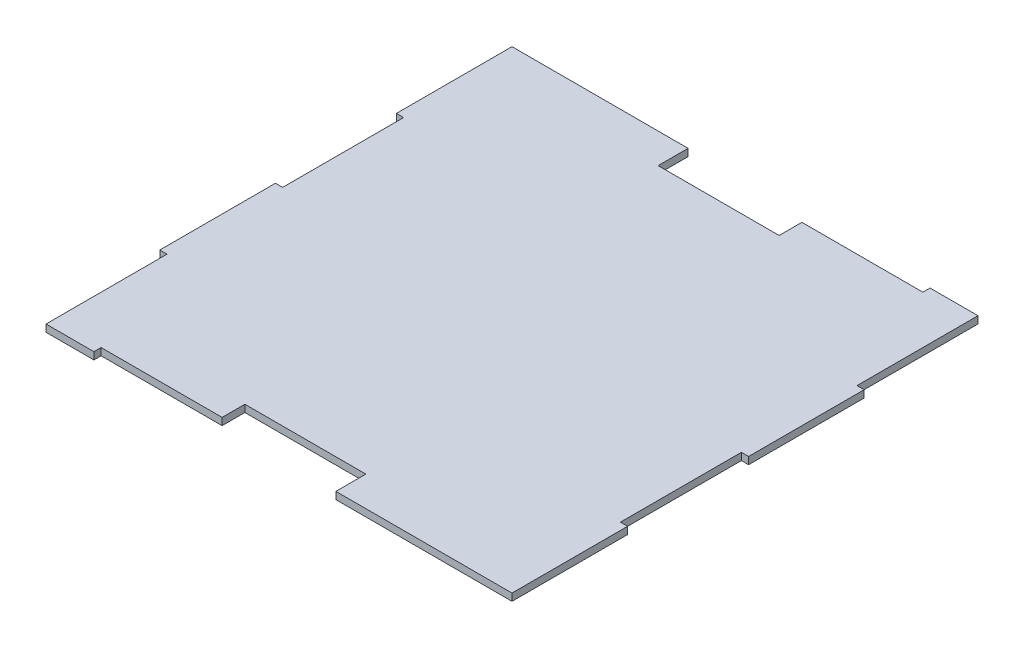
ISO-10303-21;
HEADER;
FILE_DESCRIPTION(('STEP AP214'),'2;1');
FILE_NAME('part.step','',(''),(''),'','','');
FILE_SCHEMA(('AUTOMOTIVE_DESIGN { 1 0 10303 214 1 1 1 1 }'));
ENDSEC;
DATA;
#1=APPLICATION_CONTEXT('core data for automotive mechanical design processes');
#2=APPLICATION_PROTOCOL_DEFINITION('international standard','automotive_design',2000,#1);
#3=PRODUCT_CONTEXT('',#1,'mechanical');
#4=PRODUCT('Part','Part','',(#3));
#5=PRODUCT_RELATED_PRODUCT_CATEGORY('part','',(#4));
#6=PRODUCT_DEFINITION_FORMATION('','',#4);
#7=PRODUCT_DEFINITION_CONTEXT('part definition',#1,'design');
#8=PRODUCT_DEFINITION('design','',#6,#7);
#9=PRODUCT_DEFINITION_SHAPE('','',#8);
#10=(LENGTH_UNIT() NAMED_UNIT(*) SI_UNIT(.MILLI.,.METRE.));
#11=(NAMED_UNIT(*) PLANE_ANGLE_UNIT() SI_UNIT($,.RADIAN.));
#12=(NAMED_UNIT(*) SI_UNIT($,.STERADIAN.) SOLID_ANGLE_UNIT());
#13=UNCERTAINTY_MEASURE_WITH_UNIT(LENGTH_MEASURE(1.E-05),#10,'distance_accuracy_value','');
#14=(GEOMETRIC_REPRESENTATION_CONTEXT(3) GLOBAL_UNCERTAINTY_ASSIGNED_CONTEXT((#13)) GLOBAL_UNIT_ASSIGNED_CONTEXT((#10,
#11,#12)) REPRESENTATION_CONTEXT('',''));
#15=CARTESIAN_POINT('',(0.,0.,0.));
#16=DIRECTION('',(0.,0.,1.));
#17=DIRECTION('',(1.,0.,0.));
#18=AXIS2_PLACEMENT_3D('',#15,#16,#17);
#19=CARTESIAN_POINT('',(191.5,6.,-1.052513411959E-13));
#20=DIRECTION('',(1.,0.,0.));
#21=DIRECTION('',(0.,0.,-1.));
#22=AXIS2_PLACEMENT_3D('',#19,#20,#21);
#23=PLANE('',#22);
#24=DIRECTION('',(0.,0.,1.));
#25=VECTOR('',#24,1.);
#26=CARTESIAN_POINT('',(191.5,0.,-1.052513411959E-13));
#27=LINE('',#26,#25);
#28=CARTESIAN_POINT('',(191.5,0.,2.27368041398871E-12));
#29=VERTEX_POINT('',#28);
#30=CARTESIAN_POINT('',(191.5,0.,101.));
#31=VERTEX_POINT('',#30);
#32=EDGE_CURVE('E337',#29,#31,#27,.T.);
#33=ORIENTED_EDGE('',*,*,#32,.F.);
#34=DIRECTION('',(0.,-1.,0.));
#35=VECTOR('',#34,1.);
#36=CARTESIAN_POINT('',(191.5,6.,2.27368041398871E-12));
#37=LINE('',#36,#35);
#38=CARTESIAN_POINT('',(191.5,6.,2.27368041398871E-12));
#39=VERTEX_POINT('',#38);
#40=EDGE_CURVE('E11',#39,#29,#37,.T.);
#41=ORIENTED_EDGE('',*,*,#40,.F.);
#42=DIRECTION('',(0.,0.,1.));
#43=VECTOR('',#42,1.);
#44=CARTESIAN_POINT('',(191.5,6.,-1.052513411959E-13));
#45=LINE('',#44,#43);
#46=CARTESIAN_POINT('',(191.5,6.,101.));
#47=VERTEX_POINT('',#46);
#48=EDGE_CURVE('E261',#39,#47,#45,.T.);
#49=ORIENTED_EDGE('',*,*,#48,.T.);
#50=DIRECTION('',(0.,-1.,0.));
#51=VECTOR('',#50,1.);
#52=CARTESIAN_POINT('',(191.5,6.,101.));
#53=LINE('',#52,#51);
#54=EDGE_CURVE('E152',#47,#31,#53,.T.);
#55=ORIENTED_EDGE('',*,*,#54,.T.);
#56=EDGE_LOOP('',(#33,#41,#49,#55));
#57=FACE_BOUND('',#56,.T.);
#58=ADVANCED_FACE('F41',(#57),#23,.T.);
#59=CARTESIAN_POINT('',(0.,6.,0.));
#60=DIRECTION('',(0.,0.,1.));
#61=DIRECTION('',(1.,0.,0.));
#62=AXIS2_PLACEMENT_3D('',#59,#60,#61);
#63=PLANE('',#62);
#64=DIRECTION('',(-1.,0.,0.));
#65=VECTOR('',#64,1.);
#66=CARTESIAN_POINT('',(0.,0.,0.));
#67=LINE('',#66,#65);
#68=CARTESIAN_POINT('',(197.5,0.,2.30929942830708E-12));
#69=VERTEX_POINT('',#68);
#70=EDGE_CURVE('E332',#69,#29,#67,.T.);
#71=ORIENTED_EDGE('',*,*,#70,.F.);
#72=DIRECTION('',(0.,-1.,0.));
#73=VECTOR('',#72,1.);
#74=CARTESIAN_POINT('',(197.5,6.,2.30929942830708E-12));
#75=LINE('',#74,#73);
#76=CARTESIAN_POINT('',(197.5,6.,2.30929942830708E-12));
#77=VERTEX_POINT('',#76);
#78=EDGE_CURVE('E49',#77,#69,#75,.T.);
#79=ORIENTED_EDGE('',*,*,#78,.F.);
#80=DIRECTION('',(-1.,0.,0.));
#81=VECTOR('',#80,1.);
#82=CARTESIAN_POINT('',(0.,6.,0.));
#83=LINE('',#82,#81);
#84=EDGE_CURVE('E255',#77,#39,#83,.T.);
#85=ORIENTED_EDGE('',*,*,#84,.T.);
#86=ORIENTED_EDGE('',*,*,#40,.T.);
#87=EDGE_LOOP('',(#71,#79,#85,#86));
#88=FACE_BOUND('',#87,.T.);
#89=ADVANCED_FACE('F336',(#88),#63,.T.);
#90=CARTESIAN_POINT('',(197.5,6.,0.));
#91=DIRECTION('',(-1.,0.,0.));
#92=DIRECTION('',(0.,0.,1.));
#93=AXIS2_PLACEMENT_3D('',#90,#91,#92);
#94=PLANE('',#93);
#95=DIRECTION('',(0.,0.,-1.));
#96=VECTOR('',#95,1.);
#97=CARTESIAN_POINT('',(197.5,0.,0.));
#98=LINE('',#97,#96);
#99=CARTESIAN_POINT('',(197.5,0.,-96.4999999999999));
#100=VERTEX_POINT('',#99);
#101=EDGE_CURVE('E270',#69,#100,#98,.T.);
#102=ORIENTED_EDGE('',*,*,#101,.T.);
#103=DIRECTION('',(0.,-1.,0.));
#104=VECTOR('',#103,1.);
#105=CARTESIAN_POINT('',(197.5,6.,-96.4999999999999));
#106=LINE('',#105,#104);
#107=CARTESIAN_POINT('',(197.5,6.,-96.4999999999999));
#108=VERTEX_POINT('',#107);
#109=EDGE_CURVE('E322',#108,#100,#106,.T.);
#110=ORIENTED_EDGE('',*,*,#109,.F.);
#111=DIRECTION('',(0.,0.,-1.));
#112=VECTOR('',#111,1.);
#113=CARTESIAN_POINT('',(197.5,6.,0.));
#114=LINE('',#113,#112);
#115=EDGE_CURVE('E250',#77,#108,#114,.T.);
#116=ORIENTED_EDGE('',*,*,#115,.F.);
#117=ORIENTED_EDGE('',*,*,#78,.T.);
#118=EDGE_LOOP('',(#102,#110,#116,#117));
#119=FACE_BOUND('',#118,.T.);
#120=ADVANCED_FACE('F326',(#119),#94,.F.);
#121=CARTESIAN_POINT('',(0.,6.,-96.4999999999999));
#122=DIRECTION('',(0.,0.,1.));
#123=DIRECTION('',(1.,0.,0.));
#124=AXIS2_PLACEMENT_3D('',#121,#122,#123);
#125=PLANE('',#124);
#126=DIRECTION('',(-1.,0.,0.));
#127=VECTOR('',#126,1.);
#128=CARTESIAN_POINT('',(0.,0.,-96.4999999999999));
#129=LINE('',#128,#127);
#130=CARTESIAN_POINT('',(191.5,0.,-96.4999999999999));
#131=VERTEX_POINT('',#130);
#132=EDGE_CURVE('E335',#100,#131,#129,.T.);
#133=ORIENTED_EDGE('',*,*,#132,.T.);
#134=DIRECTION('',(0.,-1.,0.));
#135=VECTOR('',#134,1.);
#136=CARTESIAN_POINT('',(191.5,6.,-96.4999999999999));
#137=LINE('',#136,#135);
#138=CARTESIAN_POINT('',(191.5,6.,-96.4999999999999));
#139=VERTEX_POINT('',#138);
#140=EDGE_CURVE('E320',#139,#131,#137,.T.);
#141=ORIENTED_EDGE('',*,*,#140,.F.);
#142=DIRECTION('',(-1.,0.,0.));
#143=VECTOR('',#142,1.);
#144=CARTESIAN_POINT('',(0.,6.,-96.4999999999999));
#145=LINE('',#144,#143);
#146=EDGE_CURVE('E254',#108,#139,#145,.T.);
#147=ORIENTED_EDGE('',*,*,#146,.F.);
#148=ORIENTED_EDGE('',*,*,#109,.T.);
#149=EDGE_LOOP('',(#133,#141,#147,#148));
#150=FACE_BOUND('',#149,.T.);
#151=ADVANCED_FACE('F552',(#150),#125,.F.);
#152=CARTESIAN_POINT('',(191.5,6.,0.));
#153=DIRECTION('',(1.,0.,0.));
#154=DIRECTION('',(0.,0.,-1.));
#155=AXIS2_PLACEMENT_3D('',#152,#153,#154);
#156=PLANE('',#155);
#157=DIRECTION('',(0.,0.,1.));
#158=VECTOR('',#157,1.);
#159=CARTESIAN_POINT('',(191.5,0.,0.));
#160=LINE('',#159,#158);
#161=CARTESIAN_POINT('',(191.5,0.,-197.5));
#162=VERTEX_POINT('',#161);
#163=EDGE_CURVE('E342',#162,#131,#160,.T.);
#164=ORIENTED_EDGE('',*,*,#163,.F.);
#165=DIRECTION('',(0.,-1.,0.));
#166=VECTOR('',#165,1.);
#167=CARTESIAN_POINT('',(191.5,6.,-197.5));
#168=LINE('',#167,#166);
#169=CARTESIAN_POINT('',(191.5,6.,-197.5));
#170=VERTEX_POINT('',#169);
#171=EDGE_CURVE('E318',#170,#162,#168,.T.);
#172=ORIENTED_EDGE('',*,*,#171,.F.);
#173=DIRECTION('',(0.,0.,1.));
#174=VECTOR('',#173,1.);
#175=CARTESIAN_POINT('',(191.5,6.,0.));
#176=LINE('',#175,#174);
#177=EDGE_CURVE('E259',#170,#139,#176,.T.);
#178=ORIENTED_EDGE('',*,*,#177,.T.);
#179=ORIENTED_EDGE('',*,*,#140,.T.);
#180=EDGE_LOOP('',(#164,#172,#178,#179));
#181=FACE_BOUND('',#180,.T.);
#182=ADVANCED_FACE('F453',(#181),#156,.T.);
#183=CARTESIAN_POINT('',(0.,6.,-197.5));
#184=DIRECTION('',(0.,0.,-1.));
#185=DIRECTION('',(-1.,0.,0.));
#186=AXIS2_PLACEMENT_3D('',#183,#184,#185);
#187=PLANE('',#186);
#188=DIRECTION('',(1.,0.,0.));
#189=VECTOR('',#188,1.);
#190=CARTESIAN_POINT('',(0.,0.,-197.5));
#191=LINE('',#190,#189);
#192=CARTESIAN_POINT('',(151.5,0.,-197.5));
#193=VERTEX_POINT('',#192);
#194=EDGE_CURVE('E344',#193,#162,#191,.T.);
#195=ORIENTED_EDGE('',*,*,#194,.F.);
#196=DIRECTION('',(0.,-1.,0.));
#197=VECTOR('',#196,1.);
#198=CARTESIAN_POINT('',(151.5,6.,-197.5));
#199=LINE('',#198,#197);
#200=CARTESIAN_POINT('',(151.5,6.,-197.5));
#201=VERTEX_POINT('',#200);
#202=EDGE_CURVE('E316',#201,#193,#199,.T.);
#203=ORIENTED_EDGE('',*,*,#202,.F.);
#204=DIRECTION('',(1.,0.,0.));
#205=VECTOR('',#204,1.);
#206=CARTESIAN_POINT('',(0.,6.,-197.5));
#207=LINE('',#206,#205);
#208=EDGE_CURVE('E446',#201,#170,#207,.T.);
#209=ORIENTED_EDGE('',*,*,#208,.T.);
#210=ORIENTED_EDGE('',*,*,#171,.T.);
#211=EDGE_LOOP('',(#195,#203,#209,#210));
#212=FACE_BOUND('',#211,.T.);
#213=ADVANCED_FACE('F459',(#212),#187,.T.);
#214=CARTESIAN_POINT('',(151.5,6.,0.));
#215=DIRECTION('',(1.,0.,0.));
#216=DIRECTION('',(0.,0.,-1.));
#217=AXIS2_PLACEMENT_3D('',#214,#215,#216);
#218=PLANE('',#217);
#219=DIRECTION('',(0.,0.,1.));
#220=VECTOR('',#219,1.);
#221=CARTESIAN_POINT('',(151.5,0.,0.));
#222=LINE('',#221,#220);
#223=CARTESIAN_POINT('',(151.5,0.,-191.5));
#224=VERTEX_POINT('',#223);
#225=EDGE_CURVE('E347',#193,#224,#222,.T.);
#226=ORIENTED_EDGE('',*,*,#225,.T.);
#227=DIRECTION('',(0.,-1.,0.));
#228=VECTOR('',#227,1.);
#229=CARTESIAN_POINT('',(151.5,6.,-191.5));
#230=LINE('',#229,#228);
#231=CARTESIAN_POINT('',(151.5,6.,-191.5));
#232=VERTEX_POINT('',#231);
#233=EDGE_CURVE('E314',#232,#224,#230,.T.);
#234=ORIENTED_EDGE('',*,*,#233,.F.);
#235=DIRECTION('',(0.,0.,1.));
#236=VECTOR('',#235,1.);
#237=CARTESIAN_POINT('',(151.5,6.,0.));
#238=LINE('',#237,#236);
#239=EDGE_CURVE('E444',#201,#232,#238,.T.);
#240=ORIENTED_EDGE('',*,*,#239,.F.);
#241=ORIENTED_EDGE('',*,*,#202,.T.);
#242=EDGE_LOOP('',(#226,#234,#240,#241));
#243=FACE_BOUND('',#242,.T.);
#244=ADVANCED_FACE('F464',(#243),#218,.F.);
#245=CARTESIAN_POINT('',(0.,6.,-191.5));
#246=DIRECTION('',(0.,0.,-1.));
#247=DIRECTION('',(-1.,0.,0.));
#248=AXIS2_PLACEMENT_3D('',#245,#246,#247);
#249=PLANE('',#248);
#250=DIRECTION('',(1.,0.,0.));
#251=VECTOR('',#250,1.);
#252=CARTESIAN_POINT('',(0.,0.,-191.5));
#253=LINE('',#252,#251);
#254=CARTESIAN_POINT('',(50.4999999999997,0.,-191.5));
#255=VERTEX_POINT('',#254);
#256=EDGE_CURVE('E351',#255,#224,#253,.T.);
#257=ORIENTED_EDGE('',*,*,#256,.F.);
#258=DIRECTION('',(0.,-1.,0.));
#259=VECTOR('',#258,1.);
#260=CARTESIAN_POINT('',(50.4999999999997,6.,-191.5));
#261=LINE('',#260,#259);
#262=CARTESIAN_POINT('',(50.4999999999997,6.,-191.5));
#263=VERTEX_POINT('',#262);
#264=EDGE_CURVE('E312',#263,#255,#261,.T.);
#265=ORIENTED_EDGE('',*,*,#264,.F.);
#266=DIRECTION('',(1.,0.,0.));
#267=VECTOR('',#266,1.);
#268=CARTESIAN_POINT('',(0.,6.,-191.5));
#269=LINE('',#268,#267);
#270=EDGE_CURVE('E441',#263,#232,#269,.T.);
#271=ORIENTED_EDGE('',*,*,#270,.T.);
#272=ORIENTED_EDGE('',*,*,#233,.T.);
#273=EDGE_LOOP('',(#257,#265,#271,#272));
#274=FACE_BOUND('',#273,.T.);
#275=ADVANCED_FACE('F471',(#274),#249,.T.);
#276=CARTESIAN_POINT('',(50.4999999999997,6.,0.));
#277=DIRECTION('',(1.,0.,0.));
#278=DIRECTION('',(0.,0.,-1.));
#279=AXIS2_PLACEMENT_3D('',#276,#277,#278);
#280=PLANE('',#279);
#281=DIRECTION('',(0.,0.,1.));
#282=VECTOR('',#281,1.);
#283=CARTESIAN_POINT('',(50.4999999999997,0.,0.));
#284=LINE('',#283,#282);
#285=CARTESIAN_POINT('',(50.4999999999997,0.,-172.5));
#286=VERTEX_POINT('',#285);
#287=EDGE_CURVE('E354',#255,#286,#284,.T.);
#288=ORIENTED_EDGE('',*,*,#287,.T.);
#289=DIRECTION('',(0.,-1.,0.));
#290=VECTOR('',#289,1.);
#291=CARTESIAN_POINT('',(50.4999999999997,6.,-172.5));
#292=LINE('',#291,#290);
#293=CARTESIAN_POINT('',(50.4999999999997,6.,-172.5));
#294=VERTEX_POINT('',#293);
#295=EDGE_CURVE('E310',#294,#286,#292,.T.);
#296=ORIENTED_EDGE('',*,*,#295,.F.);
#297=DIRECTION('',(0.,0.,1.));
#298=VECTOR('',#297,1.);
#299=CARTESIAN_POINT('',(50.4999999999997,6.,0.));
#300=LINE('',#299,#298);
#301=EDGE_CURVE('E439',#263,#294,#300,.T.);
#302=ORIENTED_EDGE('',*,*,#301,.F.);
#303=ORIENTED_EDGE('',*,*,#264,.T.);
#304=EDGE_LOOP('',(#288,#296,#302,#303));
#305=FACE_BOUND('',#304,.T.);
#306=ADVANCED_FACE('F474',(#305),#280,.F.);
#307=CARTESIAN_POINT('',(0.,6.,-172.5));
#308=DIRECTION('',(0.,0.,-1.));
#309=DIRECTION('',(-1.,0.,0.));
#310=AXIS2_PLACEMENT_3D('',#307,#308,#309);
#311=PLANE('',#310);
#312=DIRECTION('',(1.,0.,0.));
#313=VECTOR('',#312,1.);
#314=CARTESIAN_POINT('',(0.,0.,-172.5));
#315=LINE('',#314,#313);
#316=CARTESIAN_POINT('',(-50.5000000000003,0.,-172.5));
#317=VERTEX_POINT('',#316);
#318=EDGE_CURVE('E357',#317,#286,#315,.T.);
#319=ORIENTED_EDGE('',*,*,#318,.F.);
#320=DIRECTION('',(0.,-1.,0.));
#321=VECTOR('',#320,1.);
#322=CARTESIAN_POINT('',(-50.5000000000003,6.,-172.5));
#323=LINE('',#322,#321);
#324=CARTESIAN_POINT('',(-50.5000000000003,6.,-172.5));
#325=VERTEX_POINT('',#324);
#326=EDGE_CURVE('E308',#325,#317,#323,.T.);
#327=ORIENTED_EDGE('',*,*,#326,.F.);
#328=DIRECTION('',(1.,0.,0.));
#329=VECTOR('',#328,1.);
#330=CARTESIAN_POINT('',(0.,6.,-172.5));
#331=LINE('',#330,#329);
#332=EDGE_CURVE('E436',#325,#294,#331,.T.);
#333=ORIENTED_EDGE('',*,*,#332,.T.);
#334=ORIENTED_EDGE('',*,*,#295,.T.);
#335=EDGE_LOOP('',(#319,#327,#333,#334));
#336=FACE_BOUND('',#335,.T.);
#337=ADVANCED_FACE('F477',(#336),#311,.T.);
#338=CARTESIAN_POINT('',(-50.5000000000003,6.,0.));
#339=DIRECTION('',(1.,0.,0.));
#340=DIRECTION('',(0.,0.,-1.));
#341=AXIS2_PLACEMENT_3D('',#338,#339,#340);
#342=PLANE('',#341);
#343=DIRECTION('',(0.,0.,1.));
#344=VECTOR('',#343,1.);
#345=CARTESIAN_POINT('',(-50.5000000000003,0.,0.));
#346=LINE('',#345,#344);
#347=CARTESIAN_POINT('',(-50.5000000000003,0.,-197.5));
#348=VERTEX_POINT('',#347);
#349=EDGE_CURVE('E360',#348,#317,#346,.T.);
#350=ORIENTED_EDGE('',*,*,#349,.F.);
#351=DIRECTION('',(0.,-1.,0.));
#352=VECTOR('',#351,1.);
#353=CARTESIAN_POINT('',(-50.5000000000003,6.,-197.5));
#354=LINE('',#353,#352);
#355=CARTESIAN_POINT('',(-50.5000000000003,6.,-197.5));
#356=VERTEX_POINT('',#355);
#357=EDGE_CURVE('E306',#356,#348,#354,.T.);
#358=ORIENTED_EDGE('',*,*,#357,.F.);
#359=DIRECTION('',(0.,0.,1.));
#360=VECTOR('',#359,1.);
#361=CARTESIAN_POINT('',(-50.5000000000003,6.,0.));
#362=LINE('',#361,#360);
#363=EDGE_CURVE('E433',#356,#325,#362,.T.);
#364=ORIENTED_EDGE('',*,*,#363,.T.);
#365=ORIENTED_EDGE('',*,*,#326,.T.);
#366=EDGE_LOOP('',(#350,#358,#364,#365));
#367=FACE_BOUND('',#366,.T.);
#368=ADVANCED_FACE('F483',(#367),#342,.T.);
#369=CARTESIAN_POINT('',(-197.5,0.,-197.5));
#370=VERTEX_POINT('',#369);
#371=EDGE_CURVE('E348',#370,#348,#191,.T.);
#372=ORIENTED_EDGE('',*,*,#371,.F.);
#373=DIRECTION('',(0.,-1.,0.));
#374=VECTOR('',#373,1.);
#375=CARTESIAN_POINT('',(-197.5,6.,-197.5));
#376=LINE('',#375,#374);
#377=CARTESIAN_POINT('',(-197.5,6.,-197.5));
#378=VERTEX_POINT('',#377);
#379=EDGE_CURVE('E304',#378,#370,#376,.T.);
#380=ORIENTED_EDGE('',*,*,#379,.F.);
#381=EDGE_CURVE('E432',#378,#356,#207,.T.);
#382=ORIENTED_EDGE('',*,*,#381,.T.);
#383=ORIENTED_EDGE('',*,*,#357,.T.);
#384=EDGE_LOOP('',(#372,#380,#382,#383));
#385=FACE_BOUND('',#384,.T.);
#386=ADVANCED_FACE('F487',(#385),#187,.T.);
#387=CARTESIAN_POINT('',(-197.5,6.,0.));
#388=DIRECTION('',(-1.,0.,0.));
#389=DIRECTION('',(0.,0.,1.));
#390=AXIS2_PLACEMENT_3D('',#387,#388,#389);
#391=PLANE('',#390);
#392=DIRECTION('',(0.,0.,-1.));
#393=VECTOR('',#392,1.);
#394=CARTESIAN_POINT('',(-197.5,0.,0.));
#395=LINE('',#394,#393);
#396=CARTESIAN_POINT('',(-197.5,0.,-101.));
#397=VERTEX_POINT('',#396);
#398=EDGE_CURVE('E363',#397,#370,#395,.T.);
#399=ORIENTED_EDGE('',*,*,#398,.F.);
#400=DIRECTION('',(0.,-1.,0.));
#401=VECTOR('',#400,1.);
#402=CARTESIAN_POINT('',(-197.5,6.,-101.));
#403=LINE('',#402,#401);
#404=CARTESIAN_POINT('',(-197.5,6.,-101.));
#405=VERTEX_POINT('',#404);
#406=EDGE_CURVE('E302',#405,#397,#403,.T.);
#407=ORIENTED_EDGE('',*,*,#406,.F.);
#408=DIRECTION('',(0.,0.,-1.));
#409=VECTOR('',#408,1.);
#410=CARTESIAN_POINT('',(-197.5,6.,0.));
#411=LINE('',#410,#409);
#412=EDGE_CURVE('E429',#405,#378,#411,.T.);
#413=ORIENTED_EDGE('',*,*,#412,.T.);
#414=ORIENTED_EDGE('',*,*,#379,.T.);
#415=EDGE_LOOP('',(#399,#407,#413,#414));
#416=FACE_BOUND('',#415,.T.);
#417=ADVANCED_FACE('F491',(#416),#391,.T.);
#418=CARTESIAN_POINT('',(0.,6.,-101.));
#419=DIRECTION('',(0.,0.,-1.));
#420=DIRECTION('',(-1.,0.,0.));
#421=AXIS2_PLACEMENT_3D('',#418,#419,#420);
#422=PLANE('',#421);
#423=DIRECTION('',(1.,0.,0.));
#424=VECTOR('',#423,1.);
#425=CARTESIAN_POINT('',(0.,0.,-101.));
#426=LINE('',#425,#424);
#427=CARTESIAN_POINT('',(-191.5,0.,-101.));
#428=VERTEX_POINT('',#427);
#429=EDGE_CURVE('E366',#397,#428,#426,.T.);
#430=ORIENTED_EDGE('',*,*,#429,.T.);
#431=DIRECTION('',(0.,-1.,0.));
#432=VECTOR('',#431,1.);
#433=CARTESIAN_POINT('',(-191.5,6.,-101.));
#434=LINE('',#433,#432);
#435=CARTESIAN_POINT('',(-191.5,6.,-101.));
#436=VERTEX_POINT('',#435);
#437=EDGE_CURVE('E300',#436,#428,#434,.T.);
#438=ORIENTED_EDGE('',*,*,#437,.F.);
#439=DIRECTION('',(1.,0.,0.));
#440=VECTOR('',#439,1.);
#441=CARTESIAN_POINT('',(0.,6.,-101.));
#442=LINE('',#441,#440);
#443=EDGE_CURVE('E427',#405,#436,#442,.T.);
#444=ORIENTED_EDGE('',*,*,#443,.F.);
#445=ORIENTED_EDGE('',*,*,#406,.T.);
#446=EDGE_LOOP('',(#430,#438,#444,#445));
#447=FACE_BOUND('',#446,.T.);
#448=ADVANCED_FACE('F496',(#447),#422,.F.);
#449=CARTESIAN_POINT('',(-191.5,6.,0.));
#450=DIRECTION('',(-1.,0.,0.));
#451=DIRECTION('',(0.,0.,1.));
#452=AXIS2_PLACEMENT_3D('',#449,#450,#451);
#453=PLANE('',#452);
#454=DIRECTION('',(0.,0.,-1.));
#455=VECTOR('',#454,1.);
#456=CARTESIAN_POINT('',(-191.5,0.,0.));
#457=LINE('',#456,#455);
#458=CARTESIAN_POINT('',(-191.5,0.,0.));
#459=VERTEX_POINT('',#458);
#460=EDGE_CURVE('E370',#459,#428,#457,.T.);
#461=ORIENTED_EDGE('',*,*,#460,.F.);
#462=DIRECTION('',(0.,-1.,0.));
#463=VECTOR('',#462,1.);
#464=CARTESIAN_POINT('',(-191.5,6.,0.));
#465=LINE('',#464,#463);
#466=CARTESIAN_POINT('',(-191.5,6.,0.));
#467=VERTEX_POINT('',#466);
#468=EDGE_CURVE('E298',#467,#459,#465,.T.);
#469=ORIENTED_EDGE('',*,*,#468,.F.);
#470=DIRECTION('',(0.,0.,-1.));
#471=VECTOR('',#470,1.);
#472=CARTESIAN_POINT('',(-191.5,6.,0.));
#473=LINE('',#472,#471);
#474=EDGE_CURVE('E424',#467,#436,#473,.T.);
#475=ORIENTED_EDGE('',*,*,#474,.T.);
#476=ORIENTED_EDGE('',*,*,#437,.T.);
#477=EDGE_LOOP('',(#461,#469,#475,#476));
#478=FACE_BOUND('',#477,.T.);
#479=ADVANCED_FACE('F536',(#478),#453,.T.);
#480=CARTESIAN_POINT('',(0.,6.,0.));
#481=DIRECTION('',(0.,0.,-1.));
#482=DIRECTION('',(-1.,0.,0.));
#483=AXIS2_PLACEMENT_3D('',#480,#481,#482);
#484=PLANE('',#483);
#485=DIRECTION('',(1.,0.,0.));
#486=VECTOR('',#485,1.);
#487=CARTESIAN_POINT('',(0.,0.,0.));
#488=LINE('',#487,#486);
#489=CARTESIAN_POINT('',(-197.5,0.,0.));
#490=VERTEX_POINT('',#489);
#491=EDGE_CURVE('E373',#490,#459,#488,.T.);
#492=ORIENTED_EDGE('',*,*,#491,.F.);
#493=DIRECTION('',(0.,-1.,0.));
#494=VECTOR('',#493,1.);
#495=CARTESIAN_POINT('',(-197.5,6.,0.));
#496=LINE('',#495,#494);
#497=CARTESIAN_POINT('',(-197.5,6.,0.));
#498=VERTEX_POINT('',#497);
#499=EDGE_CURVE('E296',#498,#490,#496,.T.);
#500=ORIENTED_EDGE('',*,*,#499,.F.);
#501=DIRECTION('',(1.,0.,0.));
#502=VECTOR('',#501,1.);
#503=CARTESIAN_POINT('',(0.,6.,0.));
#504=LINE('',#503,#502);
#505=EDGE_CURVE('E421',#498,#467,#504,.T.);
#506=ORIENTED_EDGE('',*,*,#505,.T.);
#507=ORIENTED_EDGE('',*,*,#468,.T.);
#508=EDGE_LOOP('',(#492,#500,#506,#507));
#509=FACE_BOUND('',#508,.T.);
#510=ADVANCED_FACE('F504',(#509),#484,.T.);
#511=CARTESIAN_POINT('',(-197.5,0.,96.5));
#512=VERTEX_POINT('',#511);
#513=EDGE_CURVE('E367',#512,#490,#395,.T.);
#514=ORIENTED_EDGE('',*,*,#513,.F.);
#515=DIRECTION('',(0.,-1.,0.));
#516=VECTOR('',#515,1.);
#517=CARTESIAN_POINT('',(-197.5,6.,96.5));
#518=LINE('',#517,#516);
#519=CARTESIAN_POINT('',(-197.5,6.,96.5));
#520=VERTEX_POINT('',#519);
#521=EDGE_CURVE('E294',#520,#512,#518,.T.);
#522=ORIENTED_EDGE('',*,*,#521,.F.);
#523=EDGE_CURVE('E420',#520,#498,#411,.T.);
#524=ORIENTED_EDGE('',*,*,#523,.T.);
#525=ORIENTED_EDGE('',*,*,#499,.T.);
#526=EDGE_LOOP('',(#514,#522,#524,#525));
#527=FACE_BOUND('',#526,.T.);
#528=ADVANCED_FACE('F509',(#527),#391,.T.);
#529=CARTESIAN_POINT('',(0.,6.,96.5));
#530=DIRECTION('',(0.,0.,-1.));
#531=DIRECTION('',(-1.,0.,0.));
#532=AXIS2_PLACEMENT_3D('',#529,#530,#531);
#533=PLANE('',#532);
#534=DIRECTION('',(1.,0.,0.));
#535=VECTOR('',#534,1.);
#536=CARTESIAN_POINT('',(0.,0.,96.5));
#537=LINE('',#536,#535);
#538=CARTESIAN_POINT('',(-191.5,0.,96.5));
#539=VERTEX_POINT('',#538);
#540=EDGE_CURVE('E376',#512,#539,#537,.T.);
#541=ORIENTED_EDGE('',*,*,#540,.T.);
#542=DIRECTION('',(0.,-1.,0.));
#543=VECTOR('',#542,1.);
#544=CARTESIAN_POINT('',(-191.5,6.,96.5));
#545=LINE('',#544,#543);
#546=CARTESIAN_POINT('',(-191.5,6.,96.5));
#547=VERTEX_POINT('',#546);
#548=EDGE_CURVE('E292',#547,#539,#545,.T.);
#549=ORIENTED_EDGE('',*,*,#548,.F.);
#550=DIRECTION('',(1.,0.,0.));
#551=VECTOR('',#550,1.);
#552=CARTESIAN_POINT('',(0.,6.,96.5));
#553=LINE('',#552,#551);
#554=EDGE_CURVE('E418',#520,#547,#553,.T.);
#555=ORIENTED_EDGE('',*,*,#554,.F.);
#556=ORIENTED_EDGE('',*,*,#521,.T.);
#557=EDGE_LOOP('',(#541,#549,#555,#556));
#558=FACE_BOUND('',#557,.T.);
#559=ADVANCED_FACE('F514',(#558),#533,.F.);
#560=CARTESIAN_POINT('',(-191.5,6.,0.));
#561=DIRECTION('',(-1.,0.,0.));
#562=DIRECTION('',(0.,0.,1.));
#563=AXIS2_PLACEMENT_3D('',#560,#561,#562);
#564=PLANE('',#563);
#565=DIRECTION('',(0.,0.,-1.));
#566=VECTOR('',#565,1.);
#567=CARTESIAN_POINT('',(-191.5,0.,0.));
#568=LINE('',#567,#566);
#569=CARTESIAN_POINT('',(-191.5,0.,197.5));
#570=VERTEX_POINT('',#569);
#571=EDGE_CURVE('E379',#570,#539,#568,.T.);
#572=ORIENTED_EDGE('',*,*,#571,.F.);
#573=DIRECTION('',(0.,-1.,0.));
#574=VECTOR('',#573,1.);
#575=CARTESIAN_POINT('',(-191.5,6.,197.5));
#576=LINE('',#575,#574);
#577=CARTESIAN_POINT('',(-191.5,6.,197.5));
#578=VERTEX_POINT('',#577);
#579=EDGE_CURVE('E290',#578,#570,#576,.T.);
#580=ORIENTED_EDGE('',*,*,#579,.F.);
#581=DIRECTION('',(0.,0.,-1.));
#582=VECTOR('',#581,1.);
#583=CARTESIAN_POINT('',(-191.5,6.,0.));
#584=LINE('',#583,#582);
#585=EDGE_CURVE('E415',#578,#547,#584,.T.);
#586=ORIENTED_EDGE('',*,*,#585,.T.);
#587=ORIENTED_EDGE('',*,*,#548,.T.);
#588=EDGE_LOOP('',(#572,#580,#586,#587));
#589=FACE_BOUND('',#588,.T.);
#590=ADVANCED_FACE('F518',(#589),#564,.T.);
#591=CARTESIAN_POINT('',(0.,6.,197.5));
#592=DIRECTION('',(0.,0.,-1.));
#593=DIRECTION('',(-1.,0.,0.));
#594=AXIS2_PLACEMENT_3D('',#591,#592,#593);
#595=PLANE('',#594);
#596=DIRECTION('',(1.,0.,0.));
#597=VECTOR('',#596,1.);
#598=CARTESIAN_POINT('',(0.,0.,197.5));
#599=LINE('',#598,#597);
#600=CARTESIAN_POINT('',(-151.5,0.,197.5));
#601=VERTEX_POINT('',#600);
#602=EDGE_CURVE('E382',#570,#601,#599,.T.);
#603=ORIENTED_EDGE('',*,*,#602,.T.);
#604=DIRECTION('',(0.,-1.,0.));
#605=VECTOR('',#604,1.);
#606=CARTESIAN_POINT('',(-151.5,6.,197.5));
#607=LINE('',#606,#605);
#608=CARTESIAN_POINT('',(-151.5,6.,197.5));
#609=VERTEX_POINT('',#608);
#610=EDGE_CURVE('E287',#609,#601,#607,.T.);
#611=ORIENTED_EDGE('',*,*,#610,.F.);
#612=DIRECTION('',(1.,0.,0.));
#613=VECTOR('',#612,1.);
#614=CARTESIAN_POINT('',(0.,6.,197.5));
#615=LINE('',#614,#613);
#616=EDGE_CURVE('E240',#578,#609,#615,.T.);
#617=ORIENTED_EDGE('',*,*,#616,.F.);
#618=ORIENTED_EDGE('',*,*,#579,.T.);
#619=EDGE_LOOP('',(#603,#611,#617,#618));
#620=FACE_BOUND('',#619,.T.);
#621=ADVANCED_FACE('F523',(#620),#595,.F.);
#622=CARTESIAN_POINT('',(-151.5,6.,0.));
#623=DIRECTION('',(-1.,0.,0.));
#624=DIRECTION('',(0.,0.,1.));
#625=AXIS2_PLACEMENT_3D('',#622,#623,#624);
#626=PLANE('',#625);
#627=DIRECTION('',(0.,0.,-1.));
#628=VECTOR('',#627,1.);
#629=CARTESIAN_POINT('',(-151.5,0.,0.));
#630=LINE('',#629,#628);
#631=CARTESIAN_POINT('',(-151.5,0.,191.5));
#632=VERTEX_POINT('',#631);
#633=EDGE_CURVE('E384',#601,#632,#630,.T.);
#634=ORIENTED_EDGE('',*,*,#633,.T.);
#635=DIRECTION('',(0.,-1.,0.));
#636=VECTOR('',#635,1.);
#637=CARTESIAN_POINT('',(-151.5,6.,191.5));
#638=LINE('',#637,#636);
#639=CARTESIAN_POINT('',(-151.5,6.,191.5));
#640=VERTEX_POINT('',#639);
#641=EDGE_CURVE('E285',#640,#632,#638,.T.);
#642=ORIENTED_EDGE('',*,*,#641,.F.);
#643=DIRECTION('',(0.,0.,-1.));
#644=VECTOR('',#643,1.);
#645=CARTESIAN_POINT('',(-151.5,6.,0.));
#646=LINE('',#645,#644);
#647=EDGE_CURVE('E413',#609,#640,#646,.T.);
#648=ORIENTED_EDGE('',*,*,#647,.F.);
#649=ORIENTED_EDGE('',*,*,#610,.T.);
#650=EDGE_LOOP('',(#634,#642,#648,#649));
#651=FACE_BOUND('',#650,.T.);
#652=ADVANCED_FACE('F528',(#651),#626,.F.);
#653=CARTESIAN_POINT('',(0.,6.,191.5));
#654=DIRECTION('',(0.,0.,1.));
#655=DIRECTION('',(1.,0.,0.));
#656=AXIS2_PLACEMENT_3D('',#653,#654,#655);
#657=PLANE('',#656);
#658=DIRECTION('',(-1.,0.,0.));
#659=VECTOR('',#658,1.);
#660=CARTESIAN_POINT('',(0.,0.,191.5));
#661=LINE('',#660,#659);
#662=CARTESIAN_POINT('',(-50.5,0.,191.5));
#663=VERTEX_POINT('',#662);
#664=EDGE_CURVE('E387',#663,#632,#661,.T.);
#665=ORIENTED_EDGE('',*,*,#664,.F.);
#666=DIRECTION('',(0.,-1.,0.));
#667=VECTOR('',#666,1.);
#668=CARTESIAN_POINT('',(-50.5,6.,191.5));
#669=LINE('',#668,#667);
#670=CARTESIAN_POINT('',(-50.5,6.,191.5));
#671=VERTEX_POINT('',#670);
#672=EDGE_CURVE('E283',#671,#663,#669,.T.);
#673=ORIENTED_EDGE('',*,*,#672,.F.);
#674=DIRECTION('',(-1.,0.,0.));
#675=VECTOR('',#674,1.);
#676=CARTESIAN_POINT('',(0.,6.,191.5));
#677=LINE('',#676,#675);
#678=EDGE_CURVE('E408',#671,#640,#677,.T.);
#679=ORIENTED_EDGE('',*,*,#678,.T.);
#680=ORIENTED_EDGE('',*,*,#641,.T.);
#681=EDGE_LOOP('',(#665,#673,#679,#680));
#682=FACE_BOUND('',#681,.T.);
#683=ADVANCED_FACE('F532',(#682),#657,.T.);
#684=CARTESIAN_POINT('',(-50.5,6.,0.));
#685=DIRECTION('',(-1.,0.,0.));
#686=DIRECTION('',(0.,0.,1.));
#687=AXIS2_PLACEMENT_3D('',#684,#685,#686);
#688=PLANE('',#687);
#689=DIRECTION('',(0.,0.,-1.));
#690=VECTOR('',#689,1.);
#691=CARTESIAN_POINT('',(-50.5,0.,0.));
#692=LINE('',#691,#690);
#693=CARTESIAN_POINT('',(-50.5,0.,172.5));
#694=VERTEX_POINT('',#693);
#695=EDGE_CURVE('E390',#663,#694,#692,.T.);
#696=ORIENTED_EDGE('',*,*,#695,.T.);
#697=DIRECTION('',(0.,-1.,0.));
#698=VECTOR('',#697,1.);
#699=CARTESIAN_POINT('',(-50.5,6.,172.5));
#700=LINE('',#699,#698);
#701=CARTESIAN_POINT('',(-50.5,6.,172.5));
#702=VERTEX_POINT('',#701);
#703=EDGE_CURVE('E280',#702,#694,#700,.T.);
#704=ORIENTED_EDGE('',*,*,#703,.F.);
#705=DIRECTION('',(0.,0.,-1.));
#706=VECTOR('',#705,1.);
#707=CARTESIAN_POINT('',(-50.5,6.,0.));
#708=LINE('',#707,#706);
#709=EDGE_CURVE('E405',#671,#702,#708,.T.);
#710=ORIENTED_EDGE('',*,*,#709,.F.);
#711=ORIENTED_EDGE('',*,*,#672,.T.);
#712=EDGE_LOOP('',(#696,#704,#710,#711));
#713=FACE_BOUND('',#712,.T.);
#714=ADVANCED_FACE('F535',(#713),#688,.F.);
#715=CARTESIAN_POINT('',(0.,6.,172.5));
#716=DIRECTION('',(0.,0.,-1.));
#717=DIRECTION('',(-1.,0.,0.));
#718=AXIS2_PLACEMENT_3D('',#715,#716,#717);
#719=PLANE('',#718);
#720=DIRECTION('',(1.,0.,0.));
#721=VECTOR('',#720,1.);
#722=CARTESIAN_POINT('',(0.,0.,172.5));
#723=LINE('',#722,#721);
#724=CARTESIAN_POINT('',(50.5,0.,172.5));
#725=VERTEX_POINT('',#724);
#726=EDGE_CURVE('E391',#694,#725,#723,.T.);
#727=ORIENTED_EDGE('',*,*,#726,.T.);
#728=DIRECTION('',(0.,-1.,0.));
#729=VECTOR('',#728,1.);
#730=CARTESIAN_POINT('',(50.5,6.,172.5));
#731=LINE('',#730,#729);
#732=CARTESIAN_POINT('',(50.5,6.,172.5));
#733=VERTEX_POINT('',#732);
#734=EDGE_CURVE('E278',#733,#725,#731,.T.);
#735=ORIENTED_EDGE('',*,*,#734,.F.);
#736=DIRECTION('',(1.,0.,0.));
#737=VECTOR('',#736,1.);
#738=CARTESIAN_POINT('',(0.,6.,172.5));
#739=LINE('',#738,#737);
#740=EDGE_CURVE('E403',#702,#733,#739,.T.);
#741=ORIENTED_EDGE('',*,*,#740,.F.);
#742=ORIENTED_EDGE('',*,*,#703,.T.);
#743=EDGE_LOOP('',(#727,#735,#741,#742));
#744=FACE_BOUND('',#743,.T.);
#745=ADVANCED_FACE('F402',(#744),#719,.F.);
#746=CARTESIAN_POINT('',(50.5,6.,0.));
#747=DIRECTION('',(-1.,0.,0.));
#748=DIRECTION('',(0.,0.,1.));
#749=AXIS2_PLACEMENT_3D('',#746,#747,#748);
#750=PLANE('',#749);
#751=DIRECTION('',(0.,0.,-1.));
#752=VECTOR('',#751,1.);
#753=CARTESIAN_POINT('',(50.5,0.,0.));
#754=LINE('',#753,#752);
#755=CARTESIAN_POINT('',(50.5000000000001,0.,197.5));
#756=VERTEX_POINT('',#755);
#757=EDGE_CURVE('E273',#756,#725,#754,.T.);
#758=ORIENTED_EDGE('',*,*,#757,.F.);
#759=DIRECTION('',(0.,-1.,0.));
#760=VECTOR('',#759,1.);
#761=CARTESIAN_POINT('',(50.5000000000001,6.,197.5));
#762=LINE('',#761,#760);
#763=CARTESIAN_POINT('',(50.5000000000001,6.,197.5));
#764=VERTEX_POINT('',#763);
#765=EDGE_CURVE('E245',#764,#756,#762,.T.);
#766=ORIENTED_EDGE('',*,*,#765,.F.);
#767=DIRECTION('',(0.,0.,-1.));
#768=VECTOR('',#767,1.);
#769=CARTESIAN_POINT('',(50.5,6.,0.));
#770=LINE('',#769,#768);
#771=EDGE_CURVE('E237',#764,#733,#770,.T.);
#772=ORIENTED_EDGE('',*,*,#771,.T.);
#773=ORIENTED_EDGE('',*,*,#734,.T.);
#774=EDGE_LOOP('',(#758,#766,#772,#773));
#775=FACE_BOUND('',#774,.T.);
#776=ADVANCED_FACE('F400',(#775),#750,.T.);
#777=CARTESIAN_POINT('',(197.5,0.,197.5));
#778=VERTEX_POINT('',#777);
#779=EDGE_CURVE('E244',#756,#778,#599,.T.);
#780=ORIENTED_EDGE('',*,*,#779,.T.);
#781=DIRECTION('',(0.,-1.,0.));
#782=VECTOR('',#781,1.);
#783=CARTESIAN_POINT('',(197.5,6.,197.5));
#784=LINE('',#783,#782);
#785=CARTESIAN_POINT('',(197.5,6.,197.5));
#786=VERTEX_POINT('',#785);
#787=EDGE_CURVE('E241',#786,#778,#784,.T.);
#788=ORIENTED_EDGE('',*,*,#787,.F.);
#789=EDGE_CURVE('E231',#764,#786,#615,.T.);
#790=ORIENTED_EDGE('',*,*,#789,.F.);
#791=ORIENTED_EDGE('',*,*,#765,.T.);
#792=EDGE_LOOP('',(#780,#788,#790,#791));
#793=FACE_BOUND('',#792,.T.);
#794=ADVANCED_FACE('F242',(#793),#595,.F.);
#795=CARTESIAN_POINT('',(197.5,0.,101.));
#796=VERTEX_POINT('',#795);
#797=EDGE_CURVE('E145',#778,#796,#98,.T.);
#798=ORIENTED_EDGE('',*,*,#797,.T.);
#799=DIRECTION('',(0.,-1.,0.));
#800=VECTOR('',#799,1.);
#801=CARTESIAN_POINT('',(197.5,6.,101.));
#802=LINE('',#801,#800);
#803=CARTESIAN_POINT('',(197.5,6.,101.));
#804=VERTEX_POINT('',#803);
#805=EDGE_CURVE('E246',#804,#796,#802,.T.);
#806=ORIENTED_EDGE('',*,*,#805,.F.);
#807=EDGE_CURVE('E235',#786,#804,#114,.T.);
#808=ORIENTED_EDGE('',*,*,#807,.F.);
#809=ORIENTED_EDGE('',*,*,#787,.T.);
#810=EDGE_LOOP('',(#798,#806,#808,#809));
#811=FACE_BOUND('',#810,.T.);
#812=ADVANCED_FACE('F248',(#811),#94,.F.);
#813=CARTESIAN_POINT('',(2.33609428098208E-13,6.,101.));
#814=DIRECTION('',(0.,0.,1.));
#815=DIRECTION('',(1.,0.,0.));
#816=AXIS2_PLACEMENT_3D('',#813,#814,#815);
#817=PLANE('',#816);
#818=DIRECTION('',(-1.,0.,0.));
#819=VECTOR('',#818,1.);
#820=CARTESIAN_POINT('',(2.33609428098208E-13,0.,101.));
#821=LINE('',#820,#819);
#822=EDGE_CURVE('E263',#796,#31,#821,.T.);
#823=ORIENTED_EDGE('',*,*,#822,.T.);
#824=ORIENTED_EDGE('',*,*,#54,.F.);
#825=DIRECTION('',(-1.,0.,0.));
#826=VECTOR('',#825,1.);
#827=CARTESIAN_POINT('',(2.33609428098208E-13,6.,101.));
#828=LINE('',#827,#826);
#829=EDGE_CURVE('E57',#804,#47,#828,.T.);
#830=ORIENTED_EDGE('',*,*,#829,.F.);
#831=ORIENTED_EDGE('',*,*,#805,.T.);
#832=EDGE_LOOP('',(#823,#824,#830,#831));
#833=FACE_BOUND('',#832,.T.);
#834=ADVANCED_FACE('F681',(#833),#817,.F.);
#835=CARTESIAN_POINT('',(0.,6.,0.));
#836=DIRECTION('',(0.,1.,0.));
#837=DIRECTION('',(0.,0.,1.));
#838=AXIS2_PLACEMENT_3D('',#835,#836,#837);
#839=PLANE('',#838);
#840=ORIENTED_EDGE('',*,*,#48,.F.);
#841=ORIENTED_EDGE('',*,*,#84,.F.);
#842=ORIENTED_EDGE('',*,*,#115,.T.);
#843=ORIENTED_EDGE('',*,*,#146,.T.);
#844=ORIENTED_EDGE('',*,*,#177,.F.);
#845=ORIENTED_EDGE('',*,*,#208,.F.);
#846=ORIENTED_EDGE('',*,*,#239,.T.);
#847=ORIENTED_EDGE('',*,*,#270,.F.);
#848=ORIENTED_EDGE('',*,*,#301,.T.);
#849=ORIENTED_EDGE('',*,*,#332,.F.);
#850=ORIENTED_EDGE('',*,*,#363,.F.);
#851=ORIENTED_EDGE('',*,*,#381,.F.);
#852=ORIENTED_EDGE('',*,*,#412,.F.);
#853=ORIENTED_EDGE('',*,*,#443,.T.);
#854=ORIENTED_EDGE('',*,*,#474,.F.);
#855=ORIENTED_EDGE('',*,*,#505,.F.);
#856=ORIENTED_EDGE('',*,*,#523,.F.);
#857=ORIENTED_EDGE('',*,*,#554,.T.);
#858=ORIENTED_EDGE('',*,*,#585,.F.);
#859=ORIENTED_EDGE('',*,*,#616,.T.);
#860=ORIENTED_EDGE('',*,*,#647,.T.);
#861=ORIENTED_EDGE('',*,*,#678,.F.);
#862=ORIENTED_EDGE('',*,*,#709,.T.);
#863=ORIENTED_EDGE('',*,*,#740,.T.);
#864=ORIENTED_EDGE('',*,*,#771,.F.);
#865=ORIENTED_EDGE('',*,*,#789,.T.);
#866=ORIENTED_EDGE('',*,*,#807,.T.);
#867=ORIENTED_EDGE('',*,*,#829,.T.);
#868=EDGE_LOOP('',(#840,#841,#842,#843,#844,#845,#846,#847,#848,#849,#850,#851,#852,#853,#854,
#855,#856,#857,#858,#859,#860,#861,#862,#863,#864,#865,#866,#867));
#869=FACE_BOUND('',#868,.T.);
#870=ADVANCED_FACE('F233',(#869),#839,.T.);
#871=CARTESIAN_POINT('',(0.,0.,0.));
#872=DIRECTION('',(0.,1.,0.));
#873=DIRECTION('',(0.,0.,1.));
#874=AXIS2_PLACEMENT_3D('',#871,#872,#873);
#875=PLANE('',#874);
#876=ORIENTED_EDGE('',*,*,#32,.T.);
#877=ORIENTED_EDGE('',*,*,#822,.F.);
#878=ORIENTED_EDGE('',*,*,#797,.F.);
#879=ORIENTED_EDGE('',*,*,#779,.F.);
#880=ORIENTED_EDGE('',*,*,#757,.T.);
#881=ORIENTED_EDGE('',*,*,#726,.F.);
#882=ORIENTED_EDGE('',*,*,#695,.F.);
#883=ORIENTED_EDGE('',*,*,#664,.T.);
#884=ORIENTED_EDGE('',*,*,#633,.F.);
#885=ORIENTED_EDGE('',*,*,#602,.F.);
#886=ORIENTED_EDGE('',*,*,#571,.T.);
#887=ORIENTED_EDGE('',*,*,#540,.F.);
#888=ORIENTED_EDGE('',*,*,#513,.T.);
#889=ORIENTED_EDGE('',*,*,#491,.T.);
#890=ORIENTED_EDGE('',*,*,#460,.T.);
#891=ORIENTED_EDGE('',*,*,#429,.F.);
#892=ORIENTED_EDGE('',*,*,#398,.T.);
#893=ORIENTED_EDGE('',*,*,#371,.T.);
#894=ORIENTED_EDGE('',*,*,#349,.T.);
#895=ORIENTED_EDGE('',*,*,#318,.T.);
#896=ORIENTED_EDGE('',*,*,#287,.F.);
#897=ORIENTED_EDGE('',*,*,#256,.T.);
#898=ORIENTED_EDGE('',*,*,#225,.F.);
#899=ORIENTED_EDGE('',*,*,#194,.T.);
#900=ORIENTED_EDGE('',*,*,#163,.T.);
#901=ORIENTED_EDGE('',*,*,#132,.F.);
#902=ORIENTED_EDGE('',*,*,#101,.F.);
#903=ORIENTED_EDGE('',*,*,#70,.T.);
#904=EDGE_LOOP('',(#876,#877,#878,#879,#880,#881,#882,#883,#884,#885,#886,#887,#888,#889,#890,
#891,#892,#893,#894,#895,#896,#897,#898,#899,#900,#901,#902,#903));
#905=FACE_BOUND('',#904,.T.);
#906=ADVANCED_FACE('F331',(#905),#875,.F.);
#907=CLOSED_SHELL('',(#58,#89,#120,#151,#182,#213,#244,#275,#306,#337,#368,#386,#417,#448,#479,
#510,#528,#559,#590,#621,#652,#683,#714,#745,#776,#794,#812,#834,#870,#906));
#908=MANIFOLD_SOLID_BREP('B2',#907);
#909=ADVANCED_BREP_SHAPE_REPRESENTATION('',(#18,#908),#14);
#910=SHAPE_DEFINITION_REPRESENTATION(#9,#909);
ENDSEC;
END-ISO-10303-21;
